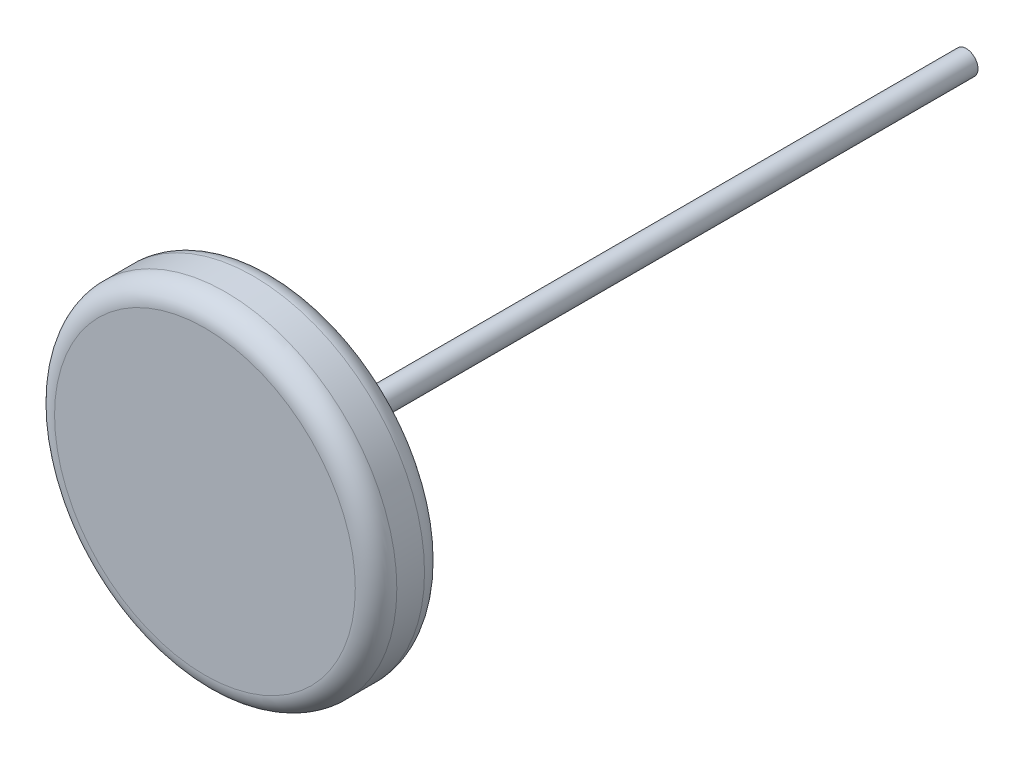
ISO-10303-21;
HEADER;
FILE_DESCRIPTION(('STEP AP214'),'2;1');
FILE_NAME('part.step','',(''),(''),'','','');
FILE_SCHEMA(('AUTOMOTIVE_DESIGN { 1 0 10303 214 1 1 1 1 }'));
ENDSEC;
DATA;
#1=APPLICATION_CONTEXT('core data for automotive mechanical design processes');
#2=APPLICATION_PROTOCOL_DEFINITION('international standard','automotive_design',2000,#1);
#3=PRODUCT_CONTEXT('',#1,'mechanical');
#4=PRODUCT('Part','Part','',(#3));
#5=PRODUCT_RELATED_PRODUCT_CATEGORY('part','',(#4));
#6=PRODUCT_DEFINITION_FORMATION('','',#4);
#7=PRODUCT_DEFINITION_CONTEXT('part definition',#1,'design');
#8=PRODUCT_DEFINITION('design','',#6,#7);
#9=PRODUCT_DEFINITION_SHAPE('','',#8);
#10=(LENGTH_UNIT() NAMED_UNIT(*) SI_UNIT(.MILLI.,.METRE.));
#11=(NAMED_UNIT(*) PLANE_ANGLE_UNIT() SI_UNIT($,.RADIAN.));
#12=(NAMED_UNIT(*) SI_UNIT($,.STERADIAN.) SOLID_ANGLE_UNIT());
#13=UNCERTAINTY_MEASURE_WITH_UNIT(LENGTH_MEASURE(1.E-05),#10,'distance_accuracy_value','');
#14=(GEOMETRIC_REPRESENTATION_CONTEXT(3) GLOBAL_UNCERTAINTY_ASSIGNED_CONTEXT((#13)) GLOBAL_UNIT_ASSIGNED_CONTEXT((#10,
#11,#12)) REPRESENTATION_CONTEXT('',''));
#15=CARTESIAN_POINT('',(0.,0.,0.));
#16=DIRECTION('',(0.,0.,1.));
#17=DIRECTION('',(1.,0.,0.));
#18=AXIS2_PLACEMENT_3D('',#15,#16,#17);
#19=CARTESIAN_POINT('',(0.,0.,100.));
#20=DIRECTION('',(0.,0.,-1.));
#21=DIRECTION('',(-1.,0.,0.));
#22=AXIS2_PLACEMENT_3D('',#19,#20,#21);
#23=CYLINDRICAL_SURFACE('',#22,1.7);
#24=CARTESIAN_POINT('',(0.,0.,97.));
#25=DIRECTION('',(0.,0.,1.));
#26=DIRECTION('',(1.,0.,0.));
#27=AXIS2_PLACEMENT_3D('',#24,#25,#26);
#28=CIRCLE('',#27,1.7);
#29=CARTESIAN_POINT('',(1.7,0.,97.));
#30=VERTEX_POINT('',#29);
#31=EDGE_CURVE('E56',#30,#30,#28,.F.);
#32=ORIENTED_EDGE('',*,*,#31,.T.);
#33=EDGE_LOOP('',(#32));
#34=FACE_BOUND('',#33,.T.);
#35=CARTESIAN_POINT('',(0.,0.,0.));
#36=DIRECTION('',(0.,0.,1.));
#37=DIRECTION('',(1.,0.,0.));
#38=AXIS2_PLACEMENT_3D('',#35,#36,#37);
#39=CIRCLE('',#38,1.7);
#40=CARTESIAN_POINT('',(1.7,0.,0.));
#41=VERTEX_POINT('',#40);
#42=EDGE_CURVE('E67',#41,#41,#39,.T.);
#43=ORIENTED_EDGE('',*,*,#42,.T.);
#44=EDGE_LOOP('',(#43));
#45=FACE_BOUND('',#44,.T.);
#46=ADVANCED_FACE('F41',(#34,#45),#23,.T.);
#47=CARTESIAN_POINT('',(0.,0.,0.));
#48=DIRECTION('',(0.,0.,1.));
#49=DIRECTION('',(1.,0.,0.));
#50=AXIS2_PLACEMENT_3D('',#47,#48,#49);
#51=PLANE('',#50);
#52=ORIENTED_EDGE('',*,*,#42,.F.);
#53=EDGE_LOOP('',(#52));
#54=FACE_BOUND('',#53,.T.);
#55=ADVANCED_FACE('F72',(#54),#51,.F.);
#56=CARTESIAN_POINT('',(0.,0.,110.));
#57=DIRECTION('',(0.,0.,-1.));
#58=DIRECTION('',(-1.,0.,0.));
#59=AXIS2_PLACEMENT_3D('',#56,#57,#58);
#60=CYLINDRICAL_SURFACE('',#59,24.7273222320244);
#61=CARTESIAN_POINT('',(0.,0.,103.));
#62=DIRECTION('',(0.,0.,1.));
#63=DIRECTION('',(1.,0.,0.));
#64=AXIS2_PLACEMENT_3D('',#61,#62,#63);
#65=CIRCLE('',#64,24.7273222320244);
#66=CARTESIAN_POINT('',(24.7273222320244,0.,103.));
#67=VERTEX_POINT('',#66);
#68=EDGE_CURVE('E48',#67,#67,#65,.T.);
#69=ORIENTED_EDGE('',*,*,#68,.T.);
#70=EDGE_LOOP('',(#69));
#71=FACE_BOUND('',#70,.T.);
#72=CARTESIAN_POINT('',(0.,0.,107.));
#73=DIRECTION('',(0.,0.,1.));
#74=DIRECTION('',(1.,0.,0.));
#75=AXIS2_PLACEMENT_3D('',#72,#73,#74);
#76=CIRCLE('',#75,24.7273222320244);
#77=CARTESIAN_POINT('',(24.7273222320244,0.,107.));
#78=VERTEX_POINT('',#77);
#79=EDGE_CURVE('E52',#78,#78,#76,.F.);
#80=ORIENTED_EDGE('',*,*,#79,.T.);
#81=EDGE_LOOP('',(#80));
#82=FACE_BOUND('',#81,.T.);
#83=ADVANCED_FACE('F74',(#71,#82),#60,.T.);
#84=CARTESIAN_POINT('',(0.,0.,110.));
#85=DIRECTION('',(0.,0.,1.));
#86=DIRECTION('',(1.,0.,0.));
#87=AXIS2_PLACEMENT_3D('',#84,#85,#86);
#88=PLANE('',#87);
#89=CARTESIAN_POINT('',(0.,0.,110.));
#90=DIRECTION('',(0.,0.,1.));
#91=DIRECTION('',(1.,0.,0.));
#92=AXIS2_PLACEMENT_3D('',#89,#90,#91);
#93=CIRCLE('',#92,21.7273222320244);
#94=CARTESIAN_POINT('',(21.7273222320244,0.,110.));
#95=VERTEX_POINT('',#94);
#96=EDGE_CURVE('E10',#95,#95,#93,.T.);
#97=ORIENTED_EDGE('',*,*,#96,.T.);
#98=EDGE_LOOP('',(#97));
#99=FACE_BOUND('',#98,.T.);
#100=ADVANCED_FACE('F80',(#99),#88,.T.);
#101=CARTESIAN_POINT('',(0.,0.,100.));
#102=DIRECTION('',(0.,0.,1.));
#103=DIRECTION('',(1.,0.,0.));
#104=AXIS2_PLACEMENT_3D('',#101,#102,#103);
#105=PLANE('',#104);
#106=CARTESIAN_POINT('',(0.,0.,100.));
#107=DIRECTION('',(0.,0.,1.));
#108=DIRECTION('',(1.,0.,0.));
#109=AXIS2_PLACEMENT_3D('',#106,#107,#108);
#110=CIRCLE('',#109,4.7);
#111=CARTESIAN_POINT('',(4.7,0.,100.));
#112=VERTEX_POINT('',#111);
#113=EDGE_CURVE('E61',#112,#112,#110,.T.);
#114=ORIENTED_EDGE('',*,*,#113,.T.);
#115=EDGE_LOOP('',(#114));
#116=FACE_BOUND('',#115,.T.);
#117=CARTESIAN_POINT('',(0.,0.,100.));
#118=DIRECTION('',(0.,0.,1.));
#119=DIRECTION('',(1.,0.,0.));
#120=AXIS2_PLACEMENT_3D('',#117,#118,#119);
#121=CIRCLE('',#120,21.7273222320244);
#122=CARTESIAN_POINT('',(21.7273222320244,0.,100.));
#123=VERTEX_POINT('',#122);
#124=EDGE_CURVE('E64',#123,#123,#121,.F.);
#125=ORIENTED_EDGE('',*,*,#124,.T.);
#126=EDGE_LOOP('',(#125));
#127=FACE_BOUND('',#126,.T.);
#128=ADVANCED_FACE('F89',(#116,#127),#105,.F.);
#129=CARTESIAN_POINT('',(0.,0.,97.));
#130=DIRECTION('',(0.,0.,1.));
#131=DIRECTION('',(1.,0.,0.));
#132=AXIS2_PLACEMENT_3D('',#129,#130,#131);
#133=TOROIDAL_SURFACE('',#132,4.7,3.);
#134=ORIENTED_EDGE('',*,*,#31,.F.);
#135=EDGE_LOOP('',(#134));
#136=FACE_BOUND('',#135,.T.);
#137=ORIENTED_EDGE('',*,*,#113,.F.);
#138=EDGE_LOOP('',(#137));
#139=FACE_BOUND('',#138,.T.);
#140=ADVANCED_FACE('F86',(#136,#139),#133,.F.);
#141=CARTESIAN_POINT('',(0.,0.,103.));
#142=DIRECTION('',(0.,0.,1.));
#143=DIRECTION('',(1.,0.,0.));
#144=AXIS2_PLACEMENT_3D('',#141,#142,#143);
#145=TOROIDAL_SURFACE('',#144,21.7273222320244,3.);
#146=ORIENTED_EDGE('',*,*,#124,.F.);
#147=EDGE_LOOP('',(#146));
#148=FACE_BOUND('',#147,.T.);
#149=ORIENTED_EDGE('',*,*,#68,.F.);
#150=EDGE_LOOP('',(#149));
#151=FACE_BOUND('',#150,.T.);
#152=ADVANCED_FACE('F88',(#148,#151),#145,.T.);
#153=CARTESIAN_POINT('',(0.,0.,107.));
#154=DIRECTION('',(0.,0.,1.));
#155=DIRECTION('',(1.,0.,0.));
#156=AXIS2_PLACEMENT_3D('',#153,#154,#155);
#157=TOROIDAL_SURFACE('',#156,21.7273222320244,3.);
#158=ORIENTED_EDGE('',*,*,#79,.F.);
#159=EDGE_LOOP('',(#158));
#160=FACE_BOUND('',#159,.T.);
#161=ORIENTED_EDGE('',*,*,#96,.F.);
#162=EDGE_LOOP('',(#161));
#163=FACE_BOUND('',#162,.T.);
#164=ADVANCED_FACE('F43',(#160,#163),#157,.T.);
#165=CLOSED_SHELL('',(#46,#55,#83,#100,#128,#140,#152,#164));
#166=MANIFOLD_SOLID_BREP('B2',#165);
#167=ADVANCED_BREP_SHAPE_REPRESENTATION('',(#18,#166),#14);
#168=SHAPE_DEFINITION_REPRESENTATION(#9,#167);
ENDSEC;
END-ISO-10303-21;
